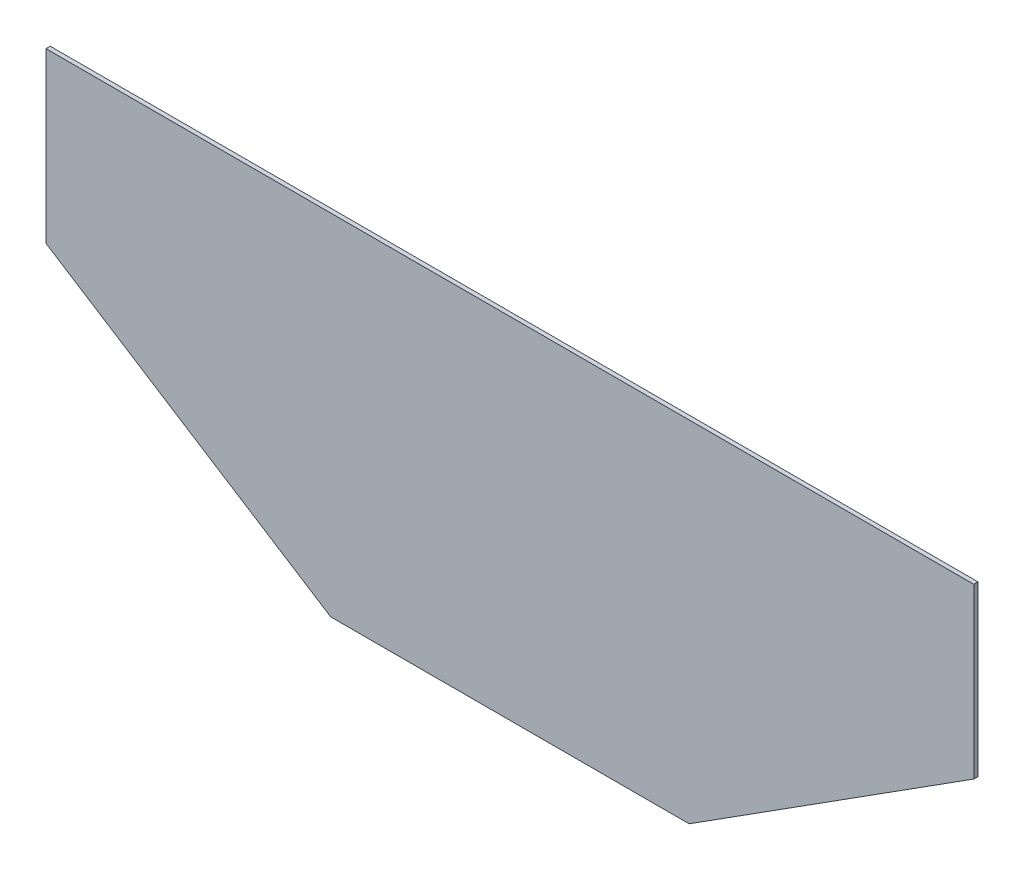
ISO-10303-21;
HEADER;
FILE_DESCRIPTION(('STEP AP214'),'2;1');
FILE_NAME('part.step','',(''),(''),'','','');
FILE_SCHEMA(('AUTOMOTIVE_DESIGN { 1 0 10303 214 1 1 1 1 }'));
ENDSEC;
DATA;
#1=APPLICATION_CONTEXT('core data for automotive mechanical design processes');
#2=APPLICATION_PROTOCOL_DEFINITION('international standard','automotive_design',2000,#1);
#3=PRODUCT_CONTEXT('',#1,'mechanical');
#4=PRODUCT('Part','Part','',(#3));
#5=PRODUCT_RELATED_PRODUCT_CATEGORY('part','',(#4));
#6=PRODUCT_DEFINITION_FORMATION('','',#4);
#7=PRODUCT_DEFINITION_CONTEXT('part definition',#1,'design');
#8=PRODUCT_DEFINITION('design','',#6,#7);
#9=PRODUCT_DEFINITION_SHAPE('','',#8);
#10=(LENGTH_UNIT() NAMED_UNIT(*) SI_UNIT(.MILLI.,.METRE.));
#11=(NAMED_UNIT(*) PLANE_ANGLE_UNIT() SI_UNIT($,.RADIAN.));
#12=(NAMED_UNIT(*) SI_UNIT($,.STERADIAN.) SOLID_ANGLE_UNIT());
#13=UNCERTAINTY_MEASURE_WITH_UNIT(LENGTH_MEASURE(1.E-05),#10,'distance_accuracy_value','');
#14=(GEOMETRIC_REPRESENTATION_CONTEXT(3) GLOBAL_UNCERTAINTY_ASSIGNED_CONTEXT((#13)) GLOBAL_UNIT_ASSIGNED_CONTEXT((#10,
#11,#12)) REPRESENTATION_CONTEXT('',''));
#15=CARTESIAN_POINT('',(0.,0.,0.));
#16=DIRECTION('',(0.,0.,1.));
#17=DIRECTION('',(1.,0.,0.));
#18=AXIS2_PLACEMENT_3D('',#15,#16,#17);
#19=CARTESIAN_POINT('',(0.,-8.091728470714,0.1));
#20=DIRECTION('',(0.,0.,1.));
#21=DIRECTION('',(1.,0.,0.));
#22=AXIS2_PLACEMENT_3D('',#19,#20,#21);
#23=PLANE('',#22);
#24=DIRECTION('',(-1.,0.,0.));
#25=VECTOR('',#24,1.);
#26=CARTESIAN_POINT('',(4.25,-12.99389100932,0.1));
#27=LINE('',#26,#25);
#28=CARTESIAN_POINT('',(4.25,-12.99389100932,0.1));
#29=VERTEX_POINT('',#28);
#30=CARTESIAN_POINT('',(-4.25,-12.99389100932,0.1));
#31=VERTEX_POINT('',#30);
#32=EDGE_CURVE('E27',#29,#31,#27,.T.);
#33=ORIENTED_EDGE('',*,*,#32,.F.);
#34=DIRECTION('',(-0.84375000000008,-0.536736376166051,0.));
#35=VECTOR('',#34,1.);
#36=CARTESIAN_POINT('',(11.,-8.7,0.1));
#37=LINE('',#36,#35);
#38=CARTESIAN_POINT('',(11.,-8.7,0.1));
#39=VERTEX_POINT('',#38);
#40=EDGE_CURVE('E71',#39,#29,#37,.T.);
#41=ORIENTED_EDGE('',*,*,#40,.F.);
#42=DIRECTION('',(0.,-1.,0.));
#43=VECTOR('',#42,1.);
#44=CARTESIAN_POINT('',(11.,-4.7,0.1));
#45=LINE('',#44,#43);
#46=CARTESIAN_POINT('',(11.,-4.7,0.1));
#47=VERTEX_POINT('',#46);
#48=EDGE_CURVE('E118',#47,#39,#45,.T.);
#49=ORIENTED_EDGE('',*,*,#48,.F.);
#50=DIRECTION('',(1.,0.,0.));
#51=VECTOR('',#50,1.);
#52=CARTESIAN_POINT('',(-11.,-4.7,0.1));
#53=LINE('',#52,#51);
#54=CARTESIAN_POINT('',(-11.,-4.7,0.1));
#55=VERTEX_POINT('',#54);
#56=EDGE_CURVE('E143',#55,#47,#53,.T.);
#57=ORIENTED_EDGE('',*,*,#56,.F.);
#58=DIRECTION('',(0.,1.,0.));
#59=VECTOR('',#58,1.);
#60=CARTESIAN_POINT('',(-11.,-8.7,0.1));
#61=LINE('',#60,#59);
#62=CARTESIAN_POINT('',(-11.,-8.7,0.1));
#63=VERTEX_POINT('',#62);
#64=EDGE_CURVE('E102',#63,#55,#61,.T.);
#65=ORIENTED_EDGE('',*,*,#64,.F.);
#66=DIRECTION('',(-0.84375000000008,0.536736376166051,0.));
#67=VECTOR('',#66,1.);
#68=CARTESIAN_POINT('',(-4.25,-12.99389100932,0.1));
#69=LINE('',#68,#67);
#70=EDGE_CURVE('E105',#31,#63,#69,.T.);
#71=ORIENTED_EDGE('',*,*,#70,.F.);
#72=EDGE_LOOP('',(#33,#41,#49,#57,#65,#71));
#73=FACE_BOUND('',#72,.T.);
#74=ADVANCED_FACE('F17',(#73),#23,.T.);
#75=CARTESIAN_POINT('',(0.,-8.091728470714,0.));
#76=DIRECTION('',(0.,0.,1.));
#77=DIRECTION('',(1.,0.,0.));
#78=AXIS2_PLACEMENT_3D('',#75,#76,#77);
#79=PLANE('',#78);
#80=DIRECTION('',(-0.84375000000008,0.536736376166051,0.));
#81=VECTOR('',#80,1.);
#82=CARTESIAN_POINT('',(-4.25,-12.99389100932,0.));
#83=LINE('',#82,#81);
#84=CARTESIAN_POINT('',(-4.25,-12.99389100932,0.));
#85=VERTEX_POINT('',#84);
#86=CARTESIAN_POINT('',(-11.,-8.7,0.));
#87=VERTEX_POINT('',#86);
#88=EDGE_CURVE('E115',#85,#87,#83,.T.);
#89=ORIENTED_EDGE('',*,*,#88,.T.);
#90=DIRECTION('',(0.,1.,0.));
#91=VECTOR('',#90,1.);
#92=CARTESIAN_POINT('',(-11.,-8.7,0.));
#93=LINE('',#92,#91);
#94=CARTESIAN_POINT('',(-11.,-4.7,0.));
#95=VERTEX_POINT('',#94);
#96=EDGE_CURVE('E131',#87,#95,#93,.T.);
#97=ORIENTED_EDGE('',*,*,#96,.T.);
#98=DIRECTION('',(1.,0.,0.));
#99=VECTOR('',#98,1.);
#100=CARTESIAN_POINT('',(-11.,-4.7,0.));
#101=LINE('',#100,#99);
#102=CARTESIAN_POINT('',(11.,-4.7,0.));
#103=VERTEX_POINT('',#102);
#104=EDGE_CURVE('E122',#95,#103,#101,.T.);
#105=ORIENTED_EDGE('',*,*,#104,.T.);
#106=DIRECTION('',(0.,-1.,0.));
#107=VECTOR('',#106,1.);
#108=CARTESIAN_POINT('',(11.,-4.7,0.));
#109=LINE('',#108,#107);
#110=CARTESIAN_POINT('',(11.,-8.7,0.));
#111=VERTEX_POINT('',#110);
#112=EDGE_CURVE('E83',#103,#111,#109,.T.);
#113=ORIENTED_EDGE('',*,*,#112,.T.);
#114=DIRECTION('',(-0.84375000000008,-0.536736376166051,0.));
#115=VECTOR('',#114,1.);
#116=CARTESIAN_POINT('',(11.,-8.7,0.));
#117=LINE('',#116,#115);
#118=CARTESIAN_POINT('',(4.25,-12.99389100932,0.));
#119=VERTEX_POINT('',#118);
#120=EDGE_CURVE('E99',#111,#119,#117,.T.);
#121=ORIENTED_EDGE('',*,*,#120,.T.);
#122=DIRECTION('',(-1.,0.,0.));
#123=VECTOR('',#122,1.);
#124=CARTESIAN_POINT('',(4.25,-12.99389100932,0.));
#125=LINE('',#124,#123);
#126=EDGE_CURVE('E11',#119,#85,#125,.T.);
#127=ORIENTED_EDGE('',*,*,#126,.T.);
#128=EDGE_LOOP('',(#89,#97,#105,#113,#121,#127));
#129=FACE_BOUND('',#128,.T.);
#130=ADVANCED_FACE('F271',(#129),#79,.F.);
#131=CARTESIAN_POINT('',(4.25,-12.99389100932,0.));
#132=DIRECTION('',(0.,-1.,0.));
#133=DIRECTION('',(0.,0.,-1.));
#134=AXIS2_PLACEMENT_3D('',#131,#132,#133);
#135=PLANE('',#134);
#136=DIRECTION('',(0.,0.,1.));
#137=VECTOR('',#136,1.);
#138=CARTESIAN_POINT('',(4.25,-12.99389100932,0.));
#139=LINE('',#138,#137);
#140=EDGE_CURVE('E98',#119,#29,#139,.T.);
#141=ORIENTED_EDGE('',*,*,#140,.T.);
#142=ORIENTED_EDGE('',*,*,#32,.T.);
#143=DIRECTION('',(0.,0.,1.));
#144=VECTOR('',#143,1.);
#145=CARTESIAN_POINT('',(-4.25,-12.99389100932,0.));
#146=LINE('',#145,#144);
#147=EDGE_CURVE('E96',#85,#31,#146,.T.);
#148=ORIENTED_EDGE('',*,*,#147,.F.);
#149=ORIENTED_EDGE('',*,*,#126,.F.);
#150=EDGE_LOOP('',(#141,#142,#148,#149));
#151=FACE_BOUND('',#150,.T.);
#152=ADVANCED_FACE('F94',(#151),#135,.T.);
#153=CARTESIAN_POINT('',(11.,-8.7,0.));
#154=DIRECTION('',(0.536736376166051,-0.84375000000008,0.));
#155=DIRECTION('',(0.,0.,-1.));
#156=AXIS2_PLACEMENT_3D('',#153,#154,#155);
#157=PLANE('',#156);
#158=DIRECTION('',(0.,0.,1.));
#159=VECTOR('',#158,1.);
#160=CARTESIAN_POINT('',(11.,-8.7,0.));
#161=LINE('',#160,#159);
#162=EDGE_CURVE('E123',#111,#39,#161,.T.);
#163=ORIENTED_EDGE('',*,*,#162,.T.);
#164=ORIENTED_EDGE('',*,*,#40,.T.);
#165=ORIENTED_EDGE('',*,*,#140,.F.);
#166=ORIENTED_EDGE('',*,*,#120,.F.);
#167=EDGE_LOOP('',(#163,#164,#165,#166));
#168=FACE_BOUND('',#167,.T.);
#169=ADVANCED_FACE('F252',(#168),#157,.T.);
#170=CARTESIAN_POINT('',(11.,-4.7,0.));
#171=DIRECTION('',(1.,0.,0.));
#172=DIRECTION('',(0.,1.,0.));
#173=AXIS2_PLACEMENT_3D('',#170,#171,#172);
#174=PLANE('',#173);
#175=DIRECTION('',(0.,0.,1.));
#176=VECTOR('',#175,1.);
#177=CARTESIAN_POINT('',(11.,-4.7,0.));
#178=LINE('',#177,#176);
#179=EDGE_CURVE('E144',#103,#47,#178,.T.);
#180=ORIENTED_EDGE('',*,*,#179,.T.);
#181=ORIENTED_EDGE('',*,*,#48,.T.);
#182=ORIENTED_EDGE('',*,*,#162,.F.);
#183=ORIENTED_EDGE('',*,*,#112,.F.);
#184=EDGE_LOOP('',(#180,#181,#182,#183));
#185=FACE_BOUND('',#184,.T.);
#186=ADVANCED_FACE('F241',(#185),#174,.T.);
#187=CARTESIAN_POINT('',(-11.,-4.7,0.));
#188=DIRECTION('',(0.,1.,0.));
#189=DIRECTION('',(1.,0.,0.));
#190=AXIS2_PLACEMENT_3D('',#187,#188,#189);
#191=PLANE('',#190);
#192=DIRECTION('',(0.,0.,1.));
#193=VECTOR('',#192,1.);
#194=CARTESIAN_POINT('',(-11.,-4.7,0.));
#195=LINE('',#194,#193);
#196=EDGE_CURVE('E126',#95,#55,#195,.T.);
#197=ORIENTED_EDGE('',*,*,#196,.T.);
#198=ORIENTED_EDGE('',*,*,#56,.T.);
#199=ORIENTED_EDGE('',*,*,#179,.F.);
#200=ORIENTED_EDGE('',*,*,#104,.F.);
#201=EDGE_LOOP('',(#197,#198,#199,#200));
#202=FACE_BOUND('',#201,.T.);
#203=ADVANCED_FACE('F230',(#202),#191,.T.);
#204=CARTESIAN_POINT('',(-11.,-8.7,0.));
#205=DIRECTION('',(-1.,0.,0.));
#206=DIRECTION('',(0.,0.,1.));
#207=AXIS2_PLACEMENT_3D('',#204,#205,#206);
#208=PLANE('',#207);
#209=DIRECTION('',(0.,0.,1.));
#210=VECTOR('',#209,1.);
#211=CARTESIAN_POINT('',(-11.,-8.7,0.));
#212=LINE('',#211,#210);
#213=EDGE_CURVE('E108',#87,#63,#212,.T.);
#214=ORIENTED_EDGE('',*,*,#213,.T.);
#215=ORIENTED_EDGE('',*,*,#64,.T.);
#216=ORIENTED_EDGE('',*,*,#196,.F.);
#217=ORIENTED_EDGE('',*,*,#96,.F.);
#218=EDGE_LOOP('',(#214,#215,#216,#217));
#219=FACE_BOUND('',#218,.T.);
#220=ADVANCED_FACE('F218',(#219),#208,.T.);
#221=CARTESIAN_POINT('',(-4.25,-12.99389100932,0.));
#222=DIRECTION('',(-0.536736376166051,-0.84375000000008,0.));
#223=DIRECTION('',(-0.84375000000008,0.536736376166051,0.));
#224=AXIS2_PLACEMENT_3D('',#221,#222,#223);
#225=PLANE('',#224);
#226=ORIENTED_EDGE('',*,*,#147,.T.);
#227=ORIENTED_EDGE('',*,*,#70,.T.);
#228=ORIENTED_EDGE('',*,*,#213,.F.);
#229=ORIENTED_EDGE('',*,*,#88,.F.);
#230=EDGE_LOOP('',(#226,#227,#228,#229));
#231=FACE_BOUND('',#230,.T.);
#232=ADVANCED_FACE('F112',(#231),#225,.T.);
#233=CLOSED_SHELL('',(#74,#130,#152,#169,#186,#203,#220,#232));
#234=MANIFOLD_SOLID_BREP('B1',#233);
#235=ADVANCED_BREP_SHAPE_REPRESENTATION('',(#18,#234),#14);
#236=SHAPE_DEFINITION_REPRESENTATION(#9,#235);
ENDSEC;
END-ISO-10303-21;
